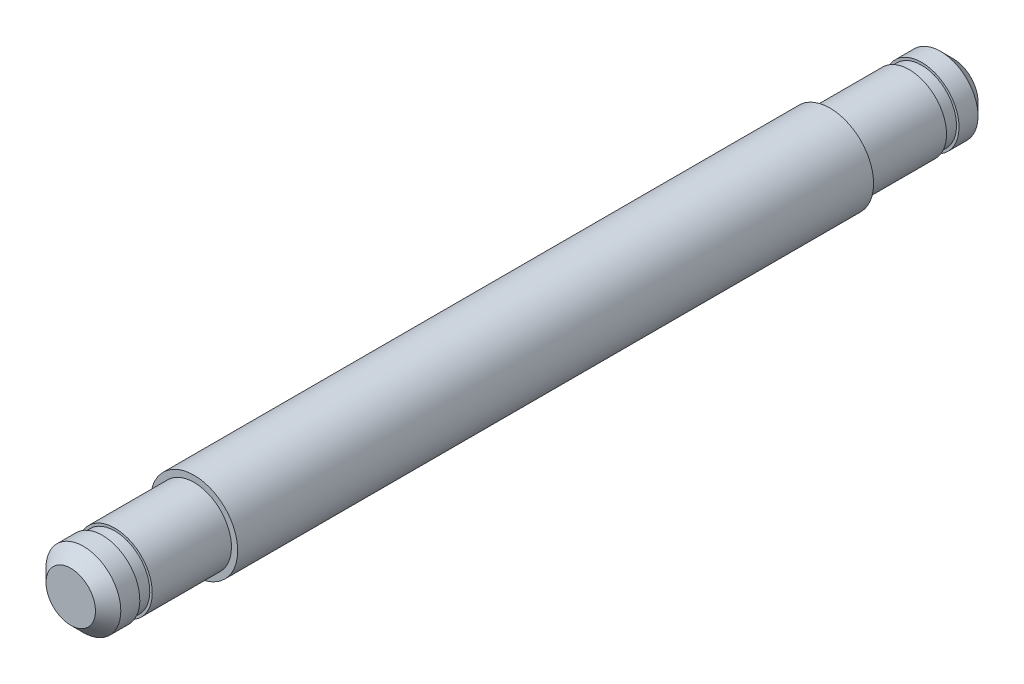
ISO-10303-21;
HEADER;
FILE_DESCRIPTION(('STEP AP214'),'2;1');
FILE_NAME('part.step','',(''),(''),'','','');
FILE_SCHEMA(('AUTOMOTIVE_DESIGN { 1 0 10303 214 1 1 1 1 }'));
ENDSEC;
DATA;
#1=APPLICATION_CONTEXT('core data for automotive mechanical design processes');
#2=APPLICATION_PROTOCOL_DEFINITION('international standard','automotive_design',2000,#1);
#3=PRODUCT_CONTEXT('',#1,'mechanical');
#4=PRODUCT('Part','Part','',(#3));
#5=PRODUCT_RELATED_PRODUCT_CATEGORY('part','',(#4));
#6=PRODUCT_DEFINITION_FORMATION('','',#4);
#7=PRODUCT_DEFINITION_CONTEXT('part definition',#1,'design');
#8=PRODUCT_DEFINITION('design','',#6,#7);
#9=PRODUCT_DEFINITION_SHAPE('','',#8);
#10=(LENGTH_UNIT() NAMED_UNIT(*) SI_UNIT(.MILLI.,.METRE.));
#11=(NAMED_UNIT(*) PLANE_ANGLE_UNIT() SI_UNIT($,.RADIAN.));
#12=(NAMED_UNIT(*) SI_UNIT($,.STERADIAN.) SOLID_ANGLE_UNIT());
#13=UNCERTAINTY_MEASURE_WITH_UNIT(LENGTH_MEASURE(1.E-05),#10,'distance_accuracy_value','');
#14=(GEOMETRIC_REPRESENTATION_CONTEXT(3) GLOBAL_UNCERTAINTY_ASSIGNED_CONTEXT((#13)) GLOBAL_UNIT_ASSIGNED_CONTEXT((#10,
#11,#12)) REPRESENTATION_CONTEXT('',''));
#15=CARTESIAN_POINT('',(0.,0.,0.));
#16=DIRECTION('',(0.,0.,1.));
#17=DIRECTION('',(1.,0.,0.));
#18=AXIS2_PLACEMENT_3D('',#15,#16,#17);
#19=CARTESIAN_POINT('',(0.,0.,0.682962962962962));
#20=DIRECTION('',(0.,0.,-1.));
#21=DIRECTION('',(0.,1.,0.));
#22=AXIS2_PLACEMENT_3D('',#19,#20,#21);
#23=CYLINDRICAL_SURFACE('',#22,1.75);
#24=CARTESIAN_POINT('',(0.,0.,12.7508));
#25=DIRECTION('',(0.,0.,-1.));
#26=DIRECTION('',(0.,1.,0.));
#27=AXIS2_PLACEMENT_3D('',#24,#25,#26);
#28=CIRCLE('',#27,1.75);
#29=CARTESIAN_POINT('',(0.,1.74999999999999,12.7508));
#30=VERTEX_POINT('',#29);
#31=EDGE_CURVE('E56',#30,#30,#28,.T.);
#32=ORIENTED_EDGE('',*,*,#31,.T.);
#33=EDGE_LOOP('',(#32));
#34=FACE_BOUND('',#33,.T.);
#35=CARTESIAN_POINT('',(0.,0.,-12.7508));
#36=DIRECTION('',(0.,0.,-1.));
#37=DIRECTION('',(0.,1.,0.));
#38=AXIS2_PLACEMENT_3D('',#35,#36,#37);
#39=CIRCLE('',#38,1.75);
#40=CARTESIAN_POINT('',(0.,1.74999999999999,-12.7508));
#41=VERTEX_POINT('',#40);
#42=EDGE_CURVE('E74',#41,#41,#39,.T.);
#43=ORIENTED_EDGE('',*,*,#42,.F.);
#44=EDGE_LOOP('',(#43));
#45=FACE_BOUND('',#44,.T.);
#46=ADVANCED_FACE('F35',(#34,#45),#23,.T.);
#47=CARTESIAN_POINT('',(0.,1.5,12.7508));
#48=DIRECTION('',(0.,0.,1.));
#49=DIRECTION('',(0.,-1.,0.));
#50=AXIS2_PLACEMENT_3D('',#47,#48,#49);
#51=PLANE('',#50);
#52=CARTESIAN_POINT('',(0.,0.,12.7508));
#53=DIRECTION('',(0.,0.,-1.));
#54=DIRECTION('',(0.,1.,0.));
#55=AXIS2_PLACEMENT_3D('',#52,#53,#54);
#56=CIRCLE('',#55,1.5);
#57=CARTESIAN_POINT('',(0.,1.49999999999999,12.7508));
#58=VERTEX_POINT('',#57);
#59=EDGE_CURVE('E59',#58,#58,#56,.T.);
#60=ORIENTED_EDGE('',*,*,#59,.T.);
#61=EDGE_LOOP('',(#60));
#62=FACE_BOUND('',#61,.T.);
#63=ORIENTED_EDGE('',*,*,#31,.F.);
#64=EDGE_LOOP('',(#63));
#65=FACE_BOUND('',#64,.T.);
#66=ADVANCED_FACE('F127',(#62,#65),#51,.T.);
#67=CARTESIAN_POINT('',(0.,0.,0.682962962962962));
#68=DIRECTION('',(0.,0.,-1.));
#69=DIRECTION('',(0.,1.,0.));
#70=AXIS2_PLACEMENT_3D('',#67,#68,#69);
#71=CYLINDRICAL_SURFACE('',#70,1.5);
#72=CARTESIAN_POINT('',(0.,0.,15.9258));
#73=DIRECTION('',(0.,0.,-1.));
#74=DIRECTION('',(0.,1.,0.));
#75=AXIS2_PLACEMENT_3D('',#72,#73,#74);
#76=CIRCLE('',#75,1.5);
#77=CARTESIAN_POINT('',(0.,1.5,15.9258));
#78=VERTEX_POINT('',#77);
#79=EDGE_CURVE('E62',#78,#78,#76,.T.);
#80=ORIENTED_EDGE('',*,*,#79,.T.);
#81=EDGE_LOOP('',(#80));
#82=FACE_BOUND('',#81,.T.);
#83=ORIENTED_EDGE('',*,*,#59,.F.);
#84=EDGE_LOOP('',(#83));
#85=FACE_BOUND('',#84,.T.);
#86=ADVANCED_FACE('F133',(#82,#85),#71,.T.);
#87=CARTESIAN_POINT('',(0.,1.39999999999999,15.9258));
#88=DIRECTION('',(0.,0.,1.));
#89=DIRECTION('',(0.,-1.,0.));
#90=AXIS2_PLACEMENT_3D('',#87,#88,#89);
#91=PLANE('',#90);
#92=CARTESIAN_POINT('',(0.,0.,15.9258));
#93=DIRECTION('',(0.,0.,-1.));
#94=DIRECTION('',(0.,1.,0.));
#95=AXIS2_PLACEMENT_3D('',#92,#93,#94);
#96=CIRCLE('',#95,1.4);
#97=CARTESIAN_POINT('',(0.,1.4,15.9258));
#98=VERTEX_POINT('',#97);
#99=EDGE_CURVE('E65',#98,#98,#96,.T.);
#100=ORIENTED_EDGE('',*,*,#99,.T.);
#101=EDGE_LOOP('',(#100));
#102=FACE_BOUND('',#101,.T.);
#103=ORIENTED_EDGE('',*,*,#79,.F.);
#104=EDGE_LOOP('',(#103));
#105=FACE_BOUND('',#104,.T.);
#106=ADVANCED_FACE('F169',(#102,#105),#91,.T.);
#107=CARTESIAN_POINT('',(0.,0.,0.682962962962962));
#108=DIRECTION('',(0.,0.,-1.));
#109=DIRECTION('',(0.,1.,0.));
#110=AXIS2_PLACEMENT_3D('',#107,#108,#109);
#111=CYLINDRICAL_SURFACE('',#110,1.4);
#112=CARTESIAN_POINT('',(0.,0.,16.4258));
#113=DIRECTION('',(0.,0.,-1.));
#114=DIRECTION('',(0.,1.,0.));
#115=AXIS2_PLACEMENT_3D('',#112,#113,#114);
#116=CIRCLE('',#115,1.4);
#117=CARTESIAN_POINT('',(0.,1.4,16.4258));
#118=VERTEX_POINT('',#117);
#119=EDGE_CURVE('E68',#118,#118,#116,.T.);
#120=ORIENTED_EDGE('',*,*,#119,.T.);
#121=EDGE_LOOP('',(#120));
#122=FACE_BOUND('',#121,.T.);
#123=ORIENTED_EDGE('',*,*,#99,.F.);
#124=EDGE_LOOP('',(#123));
#125=FACE_BOUND('',#124,.T.);
#126=ADVANCED_FACE('F163',(#122,#125),#111,.T.);
#127=CARTESIAN_POINT('',(0.,1.49999999999999,16.4258));
#128=DIRECTION('',(0.,0.,-1.));
#129=DIRECTION('',(0.,1.,0.));
#130=AXIS2_PLACEMENT_3D('',#127,#128,#129);
#131=PLANE('',#130);
#132=CARTESIAN_POINT('',(0.,0.,16.4258));
#133=DIRECTION('',(0.,0.,-1.));
#134=DIRECTION('',(0.,1.,0.));
#135=AXIS2_PLACEMENT_3D('',#132,#133,#134);
#136=CIRCLE('',#135,1.5);
#137=CARTESIAN_POINT('',(0.,1.5,16.4258));
#138=VERTEX_POINT('',#137);
#139=EDGE_CURVE('E71',#138,#138,#136,.T.);
#140=ORIENTED_EDGE('',*,*,#139,.T.);
#141=EDGE_LOOP('',(#140));
#142=FACE_BOUND('',#141,.T.);
#143=ORIENTED_EDGE('',*,*,#119,.F.);
#144=EDGE_LOOP('',(#143));
#145=FACE_BOUND('',#144,.T.);
#146=ADVANCED_FACE('F157',(#142,#145),#131,.T.);
#147=CARTESIAN_POINT('',(0.,0.,0.682962962962962));
#148=DIRECTION('',(0.,0.,-1.));
#149=DIRECTION('',(0.,1.,0.));
#150=AXIS2_PLACEMENT_3D('',#147,#148,#149);
#151=CYLINDRICAL_SURFACE('',#150,1.5);
#152=CARTESIAN_POINT('',(0.,0.,17.1878));
#153=DIRECTION('',(0.,0.,1.));
#154=DIRECTION('',(0.,-1.,0.));
#155=AXIS2_PLACEMENT_3D('',#152,#153,#154);
#156=CIRCLE('',#155,1.5);
#157=CARTESIAN_POINT('',(0.,-1.50000000000001,17.1878));
#158=VERTEX_POINT('',#157);
#159=EDGE_CURVE('E51',#158,#158,#156,.F.);
#160=ORIENTED_EDGE('',*,*,#159,.T.);
#161=EDGE_LOOP('',(#160));
#162=FACE_BOUND('',#161,.T.);
#163=ORIENTED_EDGE('',*,*,#139,.F.);
#164=EDGE_LOOP('',(#163));
#165=FACE_BOUND('',#164,.T.);
#166=ADVANCED_FACE('F154',(#162,#165),#151,.T.);
#167=CARTESIAN_POINT('',(0.,0.,17.6958));
#168=DIRECTION('',(0.,0.,1.));
#169=DIRECTION('',(0.,-1.,0.));
#170=AXIS2_PLACEMENT_3D('',#167,#168,#169);
#171=PLANE('',#170);
#172=CARTESIAN_POINT('',(0.,0.,17.6958));
#173=DIRECTION('',(0.,0.,1.));
#174=DIRECTION('',(0.,-1.,0.));
#175=AXIS2_PLACEMENT_3D('',#172,#173,#174);
#176=CIRCLE('',#175,0.991999999999993);
#177=CARTESIAN_POINT('',(0.,-0.992000000000008,17.6958));
#178=VERTEX_POINT('',#177);
#179=EDGE_CURVE('E47',#178,#178,#176,.T.);
#180=ORIENTED_EDGE('',*,*,#179,.T.);
#181=EDGE_LOOP('',(#180));
#182=FACE_BOUND('',#181,.T.);
#183=ADVANCED_FACE('F122',(#182),#171,.T.);
#184=CARTESIAN_POINT('',(0.,1.49999999999999,-12.7508));
#185=DIRECTION('',(0.,0.,-1.));
#186=DIRECTION('',(0.,-1.,0.));
#187=AXIS2_PLACEMENT_3D('',#184,#185,#186);
#188=PLANE('',#187);
#189=CARTESIAN_POINT('',(0.,0.,-12.7508));
#190=DIRECTION('',(0.,0.,-1.));
#191=DIRECTION('',(0.,1.,0.));
#192=AXIS2_PLACEMENT_3D('',#189,#190,#191);
#193=CIRCLE('',#192,1.5);
#194=CARTESIAN_POINT('',(0.,1.49999999999999,-12.7508));
#195=VERTEX_POINT('',#194);
#196=EDGE_CURVE('E77',#195,#195,#193,.T.);
#197=ORIENTED_EDGE('',*,*,#196,.F.);
#198=EDGE_LOOP('',(#197));
#199=FACE_BOUND('',#198,.T.);
#200=ORIENTED_EDGE('',*,*,#42,.T.);
#201=EDGE_LOOP('',(#200));
#202=FACE_BOUND('',#201,.T.);
#203=ADVANCED_FACE('F116',(#199,#202),#188,.T.);
#204=CARTESIAN_POINT('',(0.,0.,-0.682962962962962));
#205=DIRECTION('',(0.,0.,1.));
#206=DIRECTION('',(0.,1.,0.));
#207=AXIS2_PLACEMENT_3D('',#204,#205,#206);
#208=CYLINDRICAL_SURFACE('',#207,1.5);
#209=CARTESIAN_POINT('',(0.,0.,-15.9258));
#210=DIRECTION('',(0.,0.,-1.));
#211=DIRECTION('',(0.,1.,0.));
#212=AXIS2_PLACEMENT_3D('',#209,#210,#211);
#213=CIRCLE('',#212,1.5);
#214=CARTESIAN_POINT('',(0.,1.5,-15.9258));
#215=VERTEX_POINT('',#214);
#216=EDGE_CURVE('E80',#215,#215,#213,.T.);
#217=ORIENTED_EDGE('',*,*,#216,.F.);
#218=EDGE_LOOP('',(#217));
#219=FACE_BOUND('',#218,.T.);
#220=ORIENTED_EDGE('',*,*,#196,.T.);
#221=EDGE_LOOP('',(#220));
#222=FACE_BOUND('',#221,.T.);
#223=ADVANCED_FACE('F110',(#219,#222),#208,.T.);
#224=CARTESIAN_POINT('',(0.,1.39999999999999,-15.9258));
#225=DIRECTION('',(0.,0.,-1.));
#226=DIRECTION('',(0.,-1.,0.));
#227=AXIS2_PLACEMENT_3D('',#224,#225,#226);
#228=PLANE('',#227);
#229=CARTESIAN_POINT('',(0.,0.,-15.9258));
#230=DIRECTION('',(0.,0.,-1.));
#231=DIRECTION('',(0.,1.,0.));
#232=AXIS2_PLACEMENT_3D('',#229,#230,#231);
#233=CIRCLE('',#232,1.4);
#234=CARTESIAN_POINT('',(0.,1.4,-15.9258));
#235=VERTEX_POINT('',#234);
#236=EDGE_CURVE('E83',#235,#235,#233,.T.);
#237=ORIENTED_EDGE('',*,*,#236,.F.);
#238=EDGE_LOOP('',(#237));
#239=FACE_BOUND('',#238,.T.);
#240=ORIENTED_EDGE('',*,*,#216,.T.);
#241=EDGE_LOOP('',(#240));
#242=FACE_BOUND('',#241,.T.);
#243=ADVANCED_FACE('F104',(#239,#242),#228,.T.);
#244=CARTESIAN_POINT('',(0.,0.,-0.682962962962962));
#245=DIRECTION('',(0.,0.,1.));
#246=DIRECTION('',(0.,1.,0.));
#247=AXIS2_PLACEMENT_3D('',#244,#245,#246);
#248=CYLINDRICAL_SURFACE('',#247,1.4);
#249=CARTESIAN_POINT('',(0.,0.,-16.4258));
#250=DIRECTION('',(0.,0.,-1.));
#251=DIRECTION('',(0.,1.,0.));
#252=AXIS2_PLACEMENT_3D('',#249,#250,#251);
#253=CIRCLE('',#252,1.4);
#254=CARTESIAN_POINT('',(0.,1.39999999999999,-16.4258));
#255=VERTEX_POINT('',#254);
#256=EDGE_CURVE('E86',#255,#255,#253,.T.);
#257=ORIENTED_EDGE('',*,*,#256,.F.);
#258=EDGE_LOOP('',(#257));
#259=FACE_BOUND('',#258,.T.);
#260=ORIENTED_EDGE('',*,*,#236,.T.);
#261=EDGE_LOOP('',(#260));
#262=FACE_BOUND('',#261,.T.);
#263=ADVANCED_FACE('F98',(#259,#262),#248,.T.);
#264=CARTESIAN_POINT('',(0.,1.49999999999999,-16.4258));
#265=DIRECTION('',(0.,0.,1.));
#266=DIRECTION('',(0.,1.,0.));
#267=AXIS2_PLACEMENT_3D('',#264,#265,#266);
#268=PLANE('',#267);
#269=CARTESIAN_POINT('',(0.,0.,-16.4258));
#270=DIRECTION('',(0.,0.,-1.));
#271=DIRECTION('',(0.,1.,0.));
#272=AXIS2_PLACEMENT_3D('',#269,#270,#271);
#273=CIRCLE('',#272,1.5);
#274=CARTESIAN_POINT('',(0.,1.49999999999999,-16.4258));
#275=VERTEX_POINT('',#274);
#276=EDGE_CURVE('E89',#275,#275,#273,.T.);
#277=ORIENTED_EDGE('',*,*,#276,.F.);
#278=EDGE_LOOP('',(#277));
#279=FACE_BOUND('',#278,.T.);
#280=ORIENTED_EDGE('',*,*,#256,.T.);
#281=EDGE_LOOP('',(#280));
#282=FACE_BOUND('',#281,.T.);
#283=ADVANCED_FACE('F95',(#279,#282),#268,.T.);
#284=CARTESIAN_POINT('',(0.,0.,-0.682962962962962));
#285=DIRECTION('',(0.,0.,1.));
#286=DIRECTION('',(0.,1.,0.));
#287=AXIS2_PLACEMENT_3D('',#284,#285,#286);
#288=CYLINDRICAL_SURFACE('',#287,1.5);
#289=CARTESIAN_POINT('',(0.,0.,-17.1878));
#290=DIRECTION('',(0.,0.,-1.));
#291=DIRECTION('',(0.,1.,0.));
#292=AXIS2_PLACEMENT_3D('',#289,#290,#291);
#293=CIRCLE('',#292,1.5);
#294=CARTESIAN_POINT('',(0.,1.49999999999999,-17.1878));
#295=VERTEX_POINT('',#294);
#296=EDGE_CURVE('E10',#295,#295,#293,.F.);
#297=ORIENTED_EDGE('',*,*,#296,.T.);
#298=EDGE_LOOP('',(#297));
#299=FACE_BOUND('',#298,.T.);
#300=ORIENTED_EDGE('',*,*,#276,.T.);
#301=EDGE_LOOP('',(#300));
#302=FACE_BOUND('',#301,.T.);
#303=ADVANCED_FACE('F93',(#299,#302),#288,.T.);
#304=CARTESIAN_POINT('',(0.,0.,-17.6958));
#305=DIRECTION('',(0.,0.,-1.));
#306=DIRECTION('',(0.,-1.,0.));
#307=AXIS2_PLACEMENT_3D('',#304,#305,#306);
#308=PLANE('',#307);
#309=CARTESIAN_POINT('',(0.,0.,-17.6958));
#310=DIRECTION('',(0.,0.,-1.));
#311=DIRECTION('',(0.,1.,0.));
#312=AXIS2_PLACEMENT_3D('',#309,#310,#311);
#313=CIRCLE('',#312,0.991999999999992);
#314=CARTESIAN_POINT('',(0.,0.991999999999988,-17.6958));
#315=VERTEX_POINT('',#314);
#316=EDGE_CURVE('E43',#315,#315,#313,.T.);
#317=ORIENTED_EDGE('',*,*,#316,.T.);
#318=EDGE_LOOP('',(#317));
#319=FACE_BOUND('',#318,.T.);
#320=ADVANCED_FACE('F142',(#319),#308,.T.);
#321=CARTESIAN_POINT('',(0.,0.,17.1878));
#322=DIRECTION('',(0.,0.,-1.));
#323=DIRECTION('',(0.,1.,0.));
#324=AXIS2_PLACEMENT_3D('',#321,#322,#323);
#325=CONICAL_SURFACE('',#324,1.5,0.785398163397451);
#326=ORIENTED_EDGE('',*,*,#179,.F.);
#327=EDGE_LOOP('',(#326));
#328=FACE_BOUND('',#327,.T.);
#329=ORIENTED_EDGE('',*,*,#159,.F.);
#330=EDGE_LOOP('',(#329));
#331=FACE_BOUND('',#330,.T.);
#332=ADVANCED_FACE('F138',(#328,#331),#325,.T.);
#333=CARTESIAN_POINT('',(0.,0.,-17.6958));
#334=DIRECTION('',(0.,0.,1.));
#335=DIRECTION('',(0.,-1.,0.));
#336=AXIS2_PLACEMENT_3D('',#333,#334,#335);
#337=CONICAL_SURFACE('',#336,0.991999999999992,0.785398163397447);
#338=ORIENTED_EDGE('',*,*,#296,.F.);
#339=EDGE_LOOP('',(#338));
#340=FACE_BOUND('',#339,.T.);
#341=ORIENTED_EDGE('',*,*,#316,.F.);
#342=EDGE_LOOP('',(#341));
#343=FACE_BOUND('',#342,.T.);
#344=ADVANCED_FACE('F38',(#340,#343),#337,.T.);
#345=CLOSED_SHELL('',(#46,#66,#86,#106,#126,#146,#166,#183,#203,#223,#243,#263,#283,#303,#320,
#332,#344));
#346=MANIFOLD_SOLID_BREP('B2',#345);
#347=ADVANCED_BREP_SHAPE_REPRESENTATION('',(#18,#346),#14);
#348=SHAPE_DEFINITION_REPRESENTATION(#9,#347);
ENDSEC;
END-ISO-10303-21;
